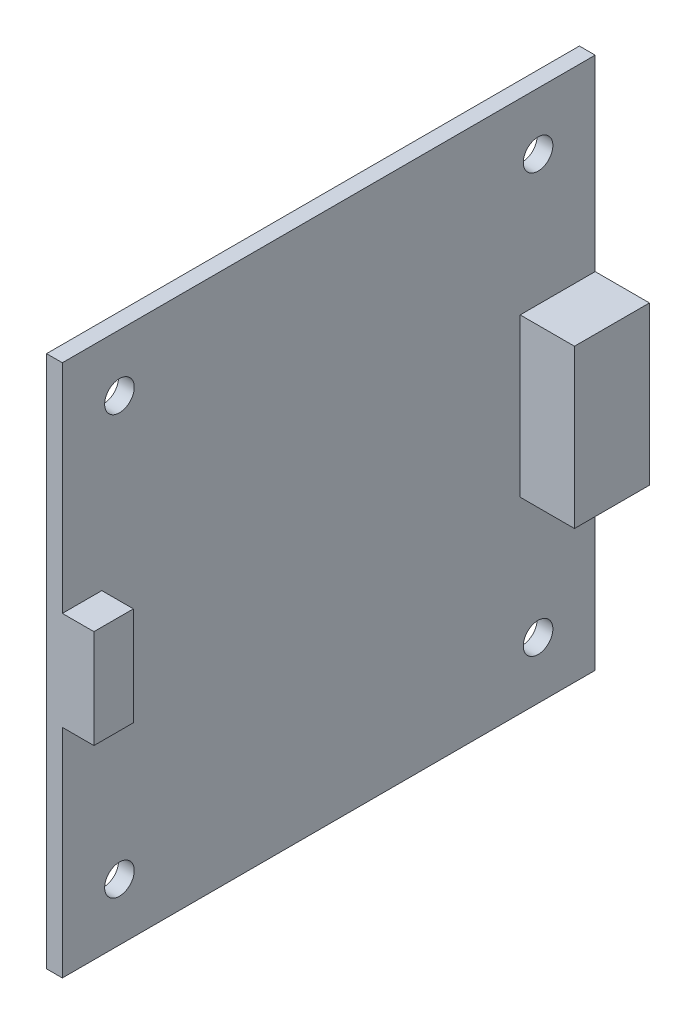
ISO-10303-21;
HEADER;
FILE_DESCRIPTION(('STEP AP214'),'2;1');
FILE_NAME('part.step','',(''),(''),'','','');
FILE_SCHEMA(('AUTOMOTIVE_DESIGN { 1 0 10303 214 1 1 1 1 }'));
ENDSEC;
DATA;
#1=APPLICATION_CONTEXT('core data for automotive mechanical design processes');
#2=APPLICATION_PROTOCOL_DEFINITION('international standard','automotive_design',2000,#1);
#3=PRODUCT_CONTEXT('',#1,'mechanical');
#4=PRODUCT('Part','Part','',(#3));
#5=PRODUCT_RELATED_PRODUCT_CATEGORY('part','',(#4));
#6=PRODUCT_DEFINITION_FORMATION('','',#4);
#7=PRODUCT_DEFINITION_CONTEXT('part definition',#1,'design');
#8=PRODUCT_DEFINITION('design','',#6,#7);
#9=PRODUCT_DEFINITION_SHAPE('','',#8);
#10=(LENGTH_UNIT() NAMED_UNIT(*) SI_UNIT(.MILLI.,.METRE.));
#11=(NAMED_UNIT(*) PLANE_ANGLE_UNIT() SI_UNIT($,.RADIAN.));
#12=(NAMED_UNIT(*) SI_UNIT($,.STERADIAN.) SOLID_ANGLE_UNIT());
#13=UNCERTAINTY_MEASURE_WITH_UNIT(LENGTH_MEASURE(1.E-05),#10,'distance_accuracy_value','');
#14=(GEOMETRIC_REPRESENTATION_CONTEXT(3) GLOBAL_UNCERTAINTY_ASSIGNED_CONTEXT((#13)) GLOBAL_UNIT_ASSIGNED_CONTEXT((#10,
#11,#12)) REPRESENTATION_CONTEXT('',''));
#15=CARTESIAN_POINT('',(0.,0.,0.));
#16=DIRECTION('',(0.,0.,1.));
#17=DIRECTION('',(1.,0.,0.));
#18=AXIS2_PLACEMENT_3D('',#15,#16,#17);
#19=CARTESIAN_POINT('',(0.,0.,0.));
#20=DIRECTION('',(1.,0.,0.));
#21=DIRECTION('',(0.,0.,-1.));
#22=AXIS2_PLACEMENT_3D('',#19,#20,#21);
#23=PLANE('',#22);
#24=DIRECTION('',(0.,0.,1.));
#25=VECTOR('',#24,1.);
#26=CARTESIAN_POINT('',(0.,27.,27.));
#27=LINE('',#26,#25);
#28=CARTESIAN_POINT('',(0.,27.,-27.));
#29=VERTEX_POINT('',#28);
#30=CARTESIAN_POINT('',(0.,27.,27.));
#31=VERTEX_POINT('',#30);
#32=EDGE_CURVE('E259',#29,#31,#27,.T.);
#33=ORIENTED_EDGE('',*,*,#32,.F.);
#34=DIRECTION('',(0.,1.,0.));
#35=VECTOR('',#34,1.);
#36=CARTESIAN_POINT('',(0.,-27.,-27.));
#37=LINE('',#36,#35);
#38=CARTESIAN_POINT('',(0.,-27.,-27.));
#39=VERTEX_POINT('',#38);
#40=EDGE_CURVE('E266',#39,#29,#37,.T.);
#41=ORIENTED_EDGE('',*,*,#40,.F.);
#42=DIRECTION('',(0.,0.,-1.));
#43=VECTOR('',#42,1.);
#44=CARTESIAN_POINT('',(0.,-27.,27.));
#45=LINE('',#44,#43);
#46=CARTESIAN_POINT('',(0.,-27.,27.));
#47=VERTEX_POINT('',#46);
#48=EDGE_CURVE('E278',#47,#39,#45,.T.);
#49=ORIENTED_EDGE('',*,*,#48,.F.);
#50=DIRECTION('',(0.,-1.,0.));
#51=VECTOR('',#50,1.);
#52=CARTESIAN_POINT('',(0.,-27.,27.));
#53=LINE('',#52,#51);
#54=EDGE_CURVE('E279',#31,#47,#53,.T.);
#55=ORIENTED_EDGE('',*,*,#54,.F.);
#56=EDGE_LOOP('',(#33,#41,#49,#55));
#57=FACE_BOUND('',#56,.T.);
#58=CARTESIAN_POINT('',(0.,-21.2132034355964,21.2132034355964));
#59=DIRECTION('',(1.,0.,0.));
#60=DIRECTION('',(0.,0.,-1.));
#61=AXIS2_PLACEMENT_3D('',#58,#59,#60);
#62=CIRCLE('',#61,1.5);
#63=CARTESIAN_POINT('',(0.,-21.2132034355964,19.7132034355964));
#64=VERTEX_POINT('',#63);
#65=EDGE_CURVE('E258',#64,#64,#62,.T.);
#66=ORIENTED_EDGE('',*,*,#65,.T.);
#67=EDGE_LOOP('',(#66));
#68=FACE_BOUND('',#67,.T.);
#69=CARTESIAN_POINT('',(0.,21.2132034355964,-21.2132034355964));
#70=DIRECTION('',(1.,0.,0.));
#71=DIRECTION('',(0.,0.,-1.));
#72=AXIS2_PLACEMENT_3D('',#69,#70,#71);
#73=CIRCLE('',#72,1.5);
#74=CARTESIAN_POINT('',(0.,21.2132034355964,-22.7132034355964));
#75=VERTEX_POINT('',#74);
#76=EDGE_CURVE('E240',#75,#75,#73,.T.);
#77=ORIENTED_EDGE('',*,*,#76,.T.);
#78=EDGE_LOOP('',(#77));
#79=FACE_BOUND('',#78,.T.);
#80=CARTESIAN_POINT('',(0.,-21.2132034355964,-21.2132034355964));
#81=DIRECTION('',(1.,0.,0.));
#82=DIRECTION('',(0.,0.,-1.));
#83=AXIS2_PLACEMENT_3D('',#80,#81,#82);
#84=CIRCLE('',#83,1.5);
#85=CARTESIAN_POINT('',(0.,-21.2132034355964,-22.7132034355964));
#86=VERTEX_POINT('',#85);
#87=EDGE_CURVE('E243',#86,#86,#84,.T.);
#88=ORIENTED_EDGE('',*,*,#87,.T.);
#89=EDGE_LOOP('',(#88));
#90=FACE_BOUND('',#89,.T.);
#91=CARTESIAN_POINT('',(0.,21.2132034355964,21.2132034355964));
#92=DIRECTION('',(1.,0.,0.));
#93=DIRECTION('',(0.,0.,-1.));
#94=AXIS2_PLACEMENT_3D('',#91,#92,#93);
#95=CIRCLE('',#94,1.5);
#96=CARTESIAN_POINT('',(0.,21.2132034355964,19.7132034355964));
#97=VERTEX_POINT('',#96);
#98=EDGE_CURVE('E248',#97,#97,#95,.T.);
#99=ORIENTED_EDGE('',*,*,#98,.T.);
#100=EDGE_LOOP('',(#99));
#101=FACE_BOUND('',#100,.T.);
#102=DIRECTION('',(0.,0.,1.));
#103=VECTOR('',#102,1.);
#104=CARTESIAN_POINT('',(0.,-2.1,1.6));
#105=LINE('',#104,#103);
#106=CARTESIAN_POINT('',(0.,-2.1,-1.6));
#107=VERTEX_POINT('',#106);
#108=CARTESIAN_POINT('',(0.,-2.1,1.6));
#109=VERTEX_POINT('',#108);
#110=EDGE_CURVE('E204',#107,#109,#105,.T.);
#111=ORIENTED_EDGE('',*,*,#110,.F.);
#112=DIRECTION('',(0.,-1.,0.));
#113=VECTOR('',#112,1.);
#114=CARTESIAN_POINT('',(0.,2.1,-1.6));
#115=LINE('',#114,#113);
#116=CARTESIAN_POINT('',(0.,2.1,-1.6));
#117=VERTEX_POINT('',#116);
#118=EDGE_CURVE('E207',#117,#107,#115,.T.);
#119=ORIENTED_EDGE('',*,*,#118,.F.);
#120=DIRECTION('',(0.,0.,-1.));
#121=VECTOR('',#120,1.);
#122=CARTESIAN_POINT('',(0.,2.1,1.6));
#123=LINE('',#122,#121);
#124=CARTESIAN_POINT('',(0.,2.1,1.6));
#125=VERTEX_POINT('',#124);
#126=EDGE_CURVE('E222',#125,#117,#123,.T.);
#127=ORIENTED_EDGE('',*,*,#126,.F.);
#128=DIRECTION('',(0.,1.,0.));
#129=VECTOR('',#128,1.);
#130=CARTESIAN_POINT('',(0.,2.1,1.6));
#131=LINE('',#130,#129);
#132=EDGE_CURVE('E217',#109,#125,#131,.T.);
#133=ORIENTED_EDGE('',*,*,#132,.F.);
#134=EDGE_LOOP('',(#111,#119,#127,#133));
#135=FACE_BOUND('',#134,.T.);
#136=ADVANCED_FACE('F39',(#57,#68,#79,#90,#101,#135),#23,.F.);
#137=CARTESIAN_POINT('',(1.6,27.,27.));
#138=DIRECTION('',(0.,-1.,0.));
#139=DIRECTION('',(0.,0.,-1.));
#140=AXIS2_PLACEMENT_3D('',#137,#138,#139);
#141=PLANE('',#140);
#142=ORIENTED_EDGE('',*,*,#32,.T.);
#143=DIRECTION('',(-1.,0.,0.));
#144=VECTOR('',#143,1.);
#145=CARTESIAN_POINT('',(1.6,27.,27.));
#146=LINE('',#145,#144);
#147=CARTESIAN_POINT('',(1.6,27.,27.));
#148=VERTEX_POINT('',#147);
#149=EDGE_CURVE('E11',#148,#31,#146,.T.);
#150=ORIENTED_EDGE('',*,*,#149,.F.);
#151=DIRECTION('',(0.,0.,1.));
#152=VECTOR('',#151,1.);
#153=CARTESIAN_POINT('',(1.6,27.,27.));
#154=LINE('',#153,#152);
#155=CARTESIAN_POINT('',(1.6,27.,-27.));
#156=VERTEX_POINT('',#155);
#157=EDGE_CURVE('E265',#156,#148,#154,.T.);
#158=ORIENTED_EDGE('',*,*,#157,.F.);
#159=DIRECTION('',(-1.,0.,0.));
#160=VECTOR('',#159,1.);
#161=CARTESIAN_POINT('',(1.6,27.,-27.));
#162=LINE('',#161,#160);
#163=EDGE_CURVE('E274',#156,#29,#162,.T.);
#164=ORIENTED_EDGE('',*,*,#163,.T.);
#165=EDGE_LOOP('',(#142,#150,#158,#164));
#166=FACE_BOUND('',#165,.T.);
#167=ADVANCED_FACE('F41',(#166),#141,.F.);
#168=CARTESIAN_POINT('',(1.6,-27.,27.));
#169=DIRECTION('',(0.,0.,-1.));
#170=DIRECTION('',(-1.,0.,0.));
#171=AXIS2_PLACEMENT_3D('',#168,#169,#170);
#172=PLANE('',#171);
#173=ORIENTED_EDGE('',*,*,#54,.T.);
#174=DIRECTION('',(-1.,0.,0.));
#175=VECTOR('',#174,1.);
#176=CARTESIAN_POINT('',(1.6,-27.,27.));
#177=LINE('',#176,#175);
#178=CARTESIAN_POINT('',(1.6,-27.,27.));
#179=VERTEX_POINT('',#178);
#180=EDGE_CURVE('E50',#179,#47,#177,.T.);
#181=ORIENTED_EDGE('',*,*,#180,.F.);
#182=DIRECTION('',(0.,-1.,0.));
#183=VECTOR('',#182,1.);
#184=CARTESIAN_POINT('',(1.6,-27.,27.));
#185=LINE('',#184,#183);
#186=CARTESIAN_POINT('',(1.6,-5.,27.));
#187=VERTEX_POINT('',#186);
#188=EDGE_CURVE('E264',#187,#179,#185,.T.);
#189=ORIENTED_EDGE('',*,*,#188,.F.);
#190=DIRECTION('',(-1.,0.,0.));
#191=VECTOR('',#190,1.);
#192=CARTESIAN_POINT('',(4.8,-5.,27.));
#193=LINE('',#192,#191);
#194=CARTESIAN_POINT('',(4.8,-5.,27.));
#195=VERTEX_POINT('',#194);
#196=EDGE_CURVE('E351',#195,#187,#193,.T.);
#197=ORIENTED_EDGE('',*,*,#196,.F.);
#198=DIRECTION('',(0.,-1.,0.));
#199=VECTOR('',#198,1.);
#200=CARTESIAN_POINT('',(4.8,-5.,27.));
#201=LINE('',#200,#199);
#202=CARTESIAN_POINT('',(4.8,5.,27.));
#203=VERTEX_POINT('',#202);
#204=EDGE_CURVE('E170',#203,#195,#201,.T.);
#205=ORIENTED_EDGE('',*,*,#204,.F.);
#206=DIRECTION('',(-1.,0.,0.));
#207=VECTOR('',#206,1.);
#208=CARTESIAN_POINT('',(4.8,5.,27.));
#209=LINE('',#208,#207);
#210=CARTESIAN_POINT('',(1.6,5.,27.));
#211=VERTEX_POINT('',#210);
#212=EDGE_CURVE('E171',#203,#211,#209,.T.);
#213=ORIENTED_EDGE('',*,*,#212,.T.);
#214=EDGE_CURVE('E270',#148,#211,#185,.T.);
#215=ORIENTED_EDGE('',*,*,#214,.F.);
#216=ORIENTED_EDGE('',*,*,#149,.T.);
#217=EDGE_LOOP('',(#173,#181,#189,#197,#205,#213,#215,#216));
#218=FACE_BOUND('',#217,.T.);
#219=ADVANCED_FACE('F341',(#218),#172,.F.);
#220=CARTESIAN_POINT('',(1.6,-27.,27.));
#221=DIRECTION('',(0.,1.,0.));
#222=DIRECTION('',(0.,0.,1.));
#223=AXIS2_PLACEMENT_3D('',#220,#221,#222);
#224=PLANE('',#223);
#225=ORIENTED_EDGE('',*,*,#48,.T.);
#226=DIRECTION('',(-1.,0.,0.));
#227=VECTOR('',#226,1.);
#228=CARTESIAN_POINT('',(1.6,-27.,-27.));
#229=LINE('',#228,#227);
#230=CARTESIAN_POINT('',(1.6,-27.,-27.));
#231=VERTEX_POINT('',#230);
#232=EDGE_CURVE('E281',#231,#39,#229,.T.);
#233=ORIENTED_EDGE('',*,*,#232,.F.);
#234=DIRECTION('',(0.,0.,-1.));
#235=VECTOR('',#234,1.);
#236=CARTESIAN_POINT('',(1.6,-27.,27.));
#237=LINE('',#236,#235);
#238=EDGE_CURVE('E269',#179,#231,#237,.T.);
#239=ORIENTED_EDGE('',*,*,#238,.F.);
#240=ORIENTED_EDGE('',*,*,#180,.T.);
#241=EDGE_LOOP('',(#225,#233,#239,#240));
#242=FACE_BOUND('',#241,.T.);
#243=ADVANCED_FACE('F295',(#242),#224,.F.);
#244=CARTESIAN_POINT('',(1.6,-27.,-27.));
#245=DIRECTION('',(0.,0.,1.));
#246=DIRECTION('',(1.,0.,0.));
#247=AXIS2_PLACEMENT_3D('',#244,#245,#246);
#248=PLANE('',#247);
#249=ORIENTED_EDGE('',*,*,#40,.T.);
#250=ORIENTED_EDGE('',*,*,#163,.F.);
#251=DIRECTION('',(0.,1.,0.));
#252=VECTOR('',#251,1.);
#253=CARTESIAN_POINT('',(1.6,-27.,-27.));
#254=LINE('',#253,#252);
#255=CARTESIAN_POINT('',(1.6,8.,-27.));
#256=VERTEX_POINT('',#255);
#257=EDGE_CURVE('E275',#256,#156,#254,.T.);
#258=ORIENTED_EDGE('',*,*,#257,.F.);
#259=DIRECTION('',(-1.,0.,0.));
#260=VECTOR('',#259,1.);
#261=CARTESIAN_POINT('',(7.1,8.,-27.));
#262=LINE('',#261,#260);
#263=CARTESIAN_POINT('',(7.1,8.,-27.));
#264=VERTEX_POINT('',#263);
#265=EDGE_CURVE('E196',#264,#256,#262,.T.);
#266=ORIENTED_EDGE('',*,*,#265,.F.);
#267=DIRECTION('',(0.,1.,0.));
#268=VECTOR('',#267,1.);
#269=CARTESIAN_POINT('',(7.1,-8.,-27.));
#270=LINE('',#269,#268);
#271=CARTESIAN_POINT('',(7.1,-8.,-27.));
#272=VERTEX_POINT('',#271);
#273=EDGE_CURVE('E185',#272,#264,#270,.T.);
#274=ORIENTED_EDGE('',*,*,#273,.F.);
#275=DIRECTION('',(-1.,0.,0.));
#276=VECTOR('',#275,1.);
#277=CARTESIAN_POINT('',(7.1,-8.,-27.));
#278=LINE('',#277,#276);
#279=CARTESIAN_POINT('',(1.6,-8.,-27.));
#280=VERTEX_POINT('',#279);
#281=EDGE_CURVE('E203',#272,#280,#278,.T.);
#282=ORIENTED_EDGE('',*,*,#281,.T.);
#283=EDGE_CURVE('E272',#231,#280,#254,.T.);
#284=ORIENTED_EDGE('',*,*,#283,.F.);
#285=ORIENTED_EDGE('',*,*,#232,.T.);
#286=EDGE_LOOP('',(#249,#250,#258,#266,#274,#282,#284,#285));
#287=FACE_BOUND('',#286,.T.);
#288=ADVANCED_FACE('F305',(#287),#248,.F.);
#289=CARTESIAN_POINT('',(1.6,0.,0.));
#290=DIRECTION('',(1.,0.,0.));
#291=DIRECTION('',(0.,0.,-1.));
#292=AXIS2_PLACEMENT_3D('',#289,#290,#291);
#293=PLANE('',#292);
#294=DIRECTION('',(0.,0.,-1.));
#295=VECTOR('',#294,1.);
#296=CARTESIAN_POINT('',(1.6,-5.,27.));
#297=LINE('',#296,#295);
#298=CARTESIAN_POINT('',(1.6,-5.,23.));
#299=VERTEX_POINT('',#298);
#300=EDGE_CURVE('E53',#187,#299,#297,.T.);
#301=ORIENTED_EDGE('',*,*,#300,.F.);
#302=ORIENTED_EDGE('',*,*,#188,.T.);
#303=ORIENTED_EDGE('',*,*,#238,.T.);
#304=ORIENTED_EDGE('',*,*,#283,.T.);
#305=DIRECTION('',(0.,0.,-1.));
#306=VECTOR('',#305,1.);
#307=CARTESIAN_POINT('',(1.6,-8.,-27.));
#308=LINE('',#307,#306);
#309=CARTESIAN_POINT('',(1.6,-8.,-19.4));
#310=VERTEX_POINT('',#309);
#311=EDGE_CURVE('E64',#310,#280,#308,.T.);
#312=ORIENTED_EDGE('',*,*,#311,.F.);
#313=DIRECTION('',(0.,-1.,0.));
#314=VECTOR('',#313,1.);
#315=CARTESIAN_POINT('',(1.6,-8.,-19.4));
#316=LINE('',#315,#314);
#317=CARTESIAN_POINT('',(1.6,8.,-19.4));
#318=VERTEX_POINT('',#317);
#319=EDGE_CURVE('E181',#318,#310,#316,.T.);
#320=ORIENTED_EDGE('',*,*,#319,.F.);
#321=DIRECTION('',(0.,0.,1.));
#322=VECTOR('',#321,1.);
#323=CARTESIAN_POINT('',(1.6,8.,-27.));
#324=LINE('',#323,#322);
#325=EDGE_CURVE('E172',#256,#318,#324,.T.);
#326=ORIENTED_EDGE('',*,*,#325,.F.);
#327=ORIENTED_EDGE('',*,*,#257,.T.);
#328=ORIENTED_EDGE('',*,*,#157,.T.);
#329=ORIENTED_EDGE('',*,*,#214,.T.);
#330=DIRECTION('',(0.,0.,1.));
#331=VECTOR('',#330,1.);
#332=CARTESIAN_POINT('',(1.6,5.,27.));
#333=LINE('',#332,#331);
#334=CARTESIAN_POINT('',(1.6,5.,23.));
#335=VERTEX_POINT('',#334);
#336=EDGE_CURVE('E166',#335,#211,#333,.T.);
#337=ORIENTED_EDGE('',*,*,#336,.F.);
#338=DIRECTION('',(0.,1.,0.));
#339=VECTOR('',#338,1.);
#340=CARTESIAN_POINT('',(1.6,-5.,23.));
#341=LINE('',#340,#339);
#342=EDGE_CURVE('E357',#299,#335,#341,.T.);
#343=ORIENTED_EDGE('',*,*,#342,.F.);
#344=EDGE_LOOP('',(#301,#302,#303,#304,#312,#320,#326,#327,#328,#329,#337,#343));
#345=FACE_BOUND('',#344,.T.);
#346=CARTESIAN_POINT('',(1.6,21.2132034355964,21.2132034355964));
#347=DIRECTION('',(1.,0.,0.));
#348=DIRECTION('',(0.,0.,-1.));
#349=AXIS2_PLACEMENT_3D('',#346,#347,#348);
#350=CIRCLE('',#349,1.5);
#351=CARTESIAN_POINT('',(1.6,21.2132034355964,19.7132034355964));
#352=VERTEX_POINT('',#351);
#353=EDGE_CURVE('E245',#352,#352,#350,.T.);
#354=ORIENTED_EDGE('',*,*,#353,.F.);
#355=EDGE_LOOP('',(#354));
#356=FACE_BOUND('',#355,.T.);
#357=CARTESIAN_POINT('',(1.6,-21.2132034355964,-21.2132034355964));
#358=DIRECTION('',(1.,0.,0.));
#359=DIRECTION('',(0.,0.,-1.));
#360=AXIS2_PLACEMENT_3D('',#357,#358,#359);
#361=CIRCLE('',#360,1.5);
#362=CARTESIAN_POINT('',(1.6,-21.2132034355964,-22.7132034355964));
#363=VERTEX_POINT('',#362);
#364=EDGE_CURVE('E253',#363,#363,#361,.T.);
#365=ORIENTED_EDGE('',*,*,#364,.F.);
#366=EDGE_LOOP('',(#365));
#367=FACE_BOUND('',#366,.T.);
#368=CARTESIAN_POINT('',(1.6,21.2132034355964,-21.2132034355964));
#369=DIRECTION('',(1.,0.,0.));
#370=DIRECTION('',(0.,0.,-1.));
#371=AXIS2_PLACEMENT_3D('',#368,#369,#370);
#372=CIRCLE('',#371,1.5);
#373=CARTESIAN_POINT('',(1.6,21.2132034355964,-22.7132034355964));
#374=VERTEX_POINT('',#373);
#375=EDGE_CURVE('E236',#374,#374,#372,.T.);
#376=ORIENTED_EDGE('',*,*,#375,.F.);
#377=EDGE_LOOP('',(#376));
#378=FACE_BOUND('',#377,.T.);
#379=CARTESIAN_POINT('',(1.6,-21.2132034355964,21.2132034355964));
#380=DIRECTION('',(1.,0.,0.));
#381=DIRECTION('',(0.,0.,-1.));
#382=AXIS2_PLACEMENT_3D('',#379,#380,#381);
#383=CIRCLE('',#382,1.5);
#384=CARTESIAN_POINT('',(1.6,-21.2132034355964,19.7132034355964));
#385=VERTEX_POINT('',#384);
#386=EDGE_CURVE('E250',#385,#385,#383,.T.);
#387=ORIENTED_EDGE('',*,*,#386,.F.);
#388=EDGE_LOOP('',(#387));
#389=FACE_BOUND('',#388,.T.);
#390=ADVANCED_FACE('F306',(#345,#356,#367,#378,#389),#293,.T.);
#391=CARTESIAN_POINT('',(0.,-21.2132034355964,21.2132034355964));
#392=DIRECTION('',(1.,0.,0.));
#393=DIRECTION('',(0.,0.,-1.));
#394=AXIS2_PLACEMENT_3D('',#391,#392,#393);
#395=CYLINDRICAL_SURFACE('',#394,1.5);
#396=ORIENTED_EDGE('',*,*,#65,.F.);
#397=EDGE_LOOP('',(#396));
#398=FACE_BOUND('',#397,.T.);
#399=ORIENTED_EDGE('',*,*,#386,.T.);
#400=EDGE_LOOP('',(#399));
#401=FACE_BOUND('',#400,.T.);
#402=ADVANCED_FACE('F491',(#398,#401),#395,.F.);
#403=CARTESIAN_POINT('',(0.,21.2132034355964,-21.2132034355964));
#404=DIRECTION('',(1.,0.,0.));
#405=DIRECTION('',(0.,0.,-1.));
#406=AXIS2_PLACEMENT_3D('',#403,#404,#405);
#407=CYLINDRICAL_SURFACE('',#406,1.5);
#408=ORIENTED_EDGE('',*,*,#76,.F.);
#409=EDGE_LOOP('',(#408));
#410=FACE_BOUND('',#409,.T.);
#411=ORIENTED_EDGE('',*,*,#375,.T.);
#412=EDGE_LOOP('',(#411));
#413=FACE_BOUND('',#412,.T.);
#414=ADVANCED_FACE('F485',(#410,#413),#407,.F.);
#415=CARTESIAN_POINT('',(0.,-21.2132034355964,-21.2132034355964));
#416=DIRECTION('',(1.,0.,0.));
#417=DIRECTION('',(0.,0.,-1.));
#418=AXIS2_PLACEMENT_3D('',#415,#416,#417);
#419=CYLINDRICAL_SURFACE('',#418,1.5);
#420=ORIENTED_EDGE('',*,*,#87,.F.);
#421=EDGE_LOOP('',(#420));
#422=FACE_BOUND('',#421,.T.);
#423=ORIENTED_EDGE('',*,*,#364,.T.);
#424=EDGE_LOOP('',(#423));
#425=FACE_BOUND('',#424,.T.);
#426=ADVANCED_FACE('F471',(#422,#425),#419,.F.);
#427=CARTESIAN_POINT('',(0.,21.2132034355964,21.2132034355964));
#428=DIRECTION('',(1.,0.,0.));
#429=DIRECTION('',(0.,0.,-1.));
#430=AXIS2_PLACEMENT_3D('',#427,#428,#429);
#431=CYLINDRICAL_SURFACE('',#430,1.5);
#432=ORIENTED_EDGE('',*,*,#98,.F.);
#433=EDGE_LOOP('',(#432));
#434=FACE_BOUND('',#433,.T.);
#435=ORIENTED_EDGE('',*,*,#353,.T.);
#436=EDGE_LOOP('',(#435));
#437=FACE_BOUND('',#436,.T.);
#438=ADVANCED_FACE('F458',(#434,#437),#431,.F.);
#439=CARTESIAN_POINT('',(-1.2,-2.1,1.6));
#440=DIRECTION('',(0.,1.,0.));
#441=DIRECTION('',(0.,0.,1.));
#442=AXIS2_PLACEMENT_3D('',#439,#440,#441);
#443=PLANE('',#442);
#444=ORIENTED_EDGE('',*,*,#110,.T.);
#445=DIRECTION('',(1.,0.,0.));
#446=VECTOR('',#445,1.);
#447=CARTESIAN_POINT('',(-1.2,-2.1,1.6));
#448=LINE('',#447,#446);
#449=CARTESIAN_POINT('',(-1.2,-2.1,1.6));
#450=VERTEX_POINT('',#449);
#451=EDGE_CURVE('E232',#450,#109,#448,.T.);
#452=ORIENTED_EDGE('',*,*,#451,.F.);
#453=DIRECTION('',(0.,0.,1.));
#454=VECTOR('',#453,1.);
#455=CARTESIAN_POINT('',(-1.2,-2.1,1.6));
#456=LINE('',#455,#454);
#457=CARTESIAN_POINT('',(-1.2,-2.1,-1.6));
#458=VERTEX_POINT('',#457);
#459=EDGE_CURVE('E202',#458,#450,#456,.T.);
#460=ORIENTED_EDGE('',*,*,#459,.F.);
#461=DIRECTION('',(1.,0.,0.));
#462=VECTOR('',#461,1.);
#463=CARTESIAN_POINT('',(-1.2,-2.1,-1.6));
#464=LINE('',#463,#462);
#465=EDGE_CURVE('E214',#458,#107,#464,.T.);
#466=ORIENTED_EDGE('',*,*,#465,.T.);
#467=EDGE_LOOP('',(#444,#452,#460,#466));
#468=FACE_BOUND('',#467,.T.);
#469=ADVANCED_FACE('F453',(#468),#443,.F.);
#470=CARTESIAN_POINT('',(-1.2,2.1,1.6));
#471=DIRECTION('',(0.,0.,-1.));
#472=DIRECTION('',(-1.,0.,0.));
#473=AXIS2_PLACEMENT_3D('',#470,#471,#472);
#474=PLANE('',#473);
#475=ORIENTED_EDGE('',*,*,#132,.T.);
#476=DIRECTION('',(1.,0.,0.));
#477=VECTOR('',#476,1.);
#478=CARTESIAN_POINT('',(-1.2,2.1,1.6));
#479=LINE('',#478,#477);
#480=CARTESIAN_POINT('',(-1.2,2.1,1.6));
#481=VERTEX_POINT('',#480);
#482=EDGE_CURVE('E231',#481,#125,#479,.T.);
#483=ORIENTED_EDGE('',*,*,#482,.F.);
#484=DIRECTION('',(0.,1.,0.));
#485=VECTOR('',#484,1.);
#486=CARTESIAN_POINT('',(-1.2,2.1,1.6));
#487=LINE('',#486,#485);
#488=EDGE_CURVE('E208',#450,#481,#487,.T.);
#489=ORIENTED_EDGE('',*,*,#488,.F.);
#490=ORIENTED_EDGE('',*,*,#451,.T.);
#491=EDGE_LOOP('',(#475,#483,#489,#490));
#492=FACE_BOUND('',#491,.T.);
#493=ADVANCED_FACE('F441',(#492),#474,.F.);
#494=CARTESIAN_POINT('',(-1.2,2.1,1.6));
#495=DIRECTION('',(0.,-1.,0.));
#496=DIRECTION('',(0.,0.,-1.));
#497=AXIS2_PLACEMENT_3D('',#494,#495,#496);
#498=PLANE('',#497);
#499=ORIENTED_EDGE('',*,*,#126,.T.);
#500=DIRECTION('',(1.,0.,0.));
#501=VECTOR('',#500,1.);
#502=CARTESIAN_POINT('',(-1.2,2.1,-1.6));
#503=LINE('',#502,#501);
#504=CARTESIAN_POINT('',(-1.2,2.1,-1.6));
#505=VERTEX_POINT('',#504);
#506=EDGE_CURVE('E227',#505,#117,#503,.T.);
#507=ORIENTED_EDGE('',*,*,#506,.F.);
#508=DIRECTION('',(0.,0.,-1.));
#509=VECTOR('',#508,1.);
#510=CARTESIAN_POINT('',(-1.2,2.1,1.6));
#511=LINE('',#510,#509);
#512=EDGE_CURVE('E211',#481,#505,#511,.T.);
#513=ORIENTED_EDGE('',*,*,#512,.F.);
#514=ORIENTED_EDGE('',*,*,#482,.T.);
#515=EDGE_LOOP('',(#499,#507,#513,#514));
#516=FACE_BOUND('',#515,.T.);
#517=ADVANCED_FACE('F434',(#516),#498,.F.);
#518=CARTESIAN_POINT('',(-1.2,2.1,-1.6));
#519=DIRECTION('',(0.,0.,1.));
#520=DIRECTION('',(1.,0.,0.));
#521=AXIS2_PLACEMENT_3D('',#518,#519,#520);
#522=PLANE('',#521);
#523=ORIENTED_EDGE('',*,*,#118,.T.);
#524=ORIENTED_EDGE('',*,*,#465,.F.);
#525=DIRECTION('',(0.,-1.,0.));
#526=VECTOR('',#525,1.);
#527=CARTESIAN_POINT('',(-1.2,2.1,-1.6));
#528=LINE('',#527,#526);
#529=EDGE_CURVE('E213',#505,#458,#528,.T.);
#530=ORIENTED_EDGE('',*,*,#529,.F.);
#531=ORIENTED_EDGE('',*,*,#506,.T.);
#532=EDGE_LOOP('',(#523,#524,#530,#531));
#533=FACE_BOUND('',#532,.T.);
#534=ADVANCED_FACE('F426',(#533),#522,.F.);
#535=CARTESIAN_POINT('',(-1.2,0.,0.));
#536=DIRECTION('',(-1.,0.,0.));
#537=DIRECTION('',(0.,0.,1.));
#538=AXIS2_PLACEMENT_3D('',#535,#536,#537);
#539=PLANE('',#538);
#540=ORIENTED_EDGE('',*,*,#459,.T.);
#541=ORIENTED_EDGE('',*,*,#488,.T.);
#542=ORIENTED_EDGE('',*,*,#512,.T.);
#543=ORIENTED_EDGE('',*,*,#529,.T.);
#544=EDGE_LOOP('',(#540,#541,#542,#543));
#545=FACE_BOUND('',#544,.T.);
#546=ADVANCED_FACE('F417',(#545),#539,.T.);
#547=CARTESIAN_POINT('',(7.1,-8.,-27.));
#548=DIRECTION('',(0.,1.,0.));
#549=DIRECTION('',(0.,0.,1.));
#550=AXIS2_PLACEMENT_3D('',#547,#548,#549);
#551=PLANE('',#550);
#552=ORIENTED_EDGE('',*,*,#311,.T.);
#553=ORIENTED_EDGE('',*,*,#281,.F.);
#554=DIRECTION('',(0.,0.,-1.));
#555=VECTOR('',#554,1.);
#556=CARTESIAN_POINT('',(7.1,-8.,-27.));
#557=LINE('',#556,#555);
#558=CARTESIAN_POINT('',(7.1,-8.,-19.4));
#559=VERTEX_POINT('',#558);
#560=EDGE_CURVE('E177',#559,#272,#557,.T.);
#561=ORIENTED_EDGE('',*,*,#560,.F.);
#562=DIRECTION('',(-1.,0.,0.));
#563=VECTOR('',#562,1.);
#564=CARTESIAN_POINT('',(7.1,-8.,-19.4));
#565=LINE('',#564,#563);
#566=EDGE_CURVE('E187',#559,#310,#565,.T.);
#567=ORIENTED_EDGE('',*,*,#566,.T.);
#568=EDGE_LOOP('',(#552,#553,#561,#567));
#569=FACE_BOUND('',#568,.T.);
#570=ADVANCED_FACE('F323',(#569),#551,.F.);
#571=CARTESIAN_POINT('',(7.1,8.,-27.));
#572=DIRECTION('',(0.,-1.,0.));
#573=DIRECTION('',(0.,0.,-1.));
#574=AXIS2_PLACEMENT_3D('',#571,#572,#573);
#575=PLANE('',#574);
#576=ORIENTED_EDGE('',*,*,#325,.T.);
#577=DIRECTION('',(-1.,0.,0.));
#578=VECTOR('',#577,1.);
#579=CARTESIAN_POINT('',(7.1,8.,-19.4));
#580=LINE('',#579,#578);
#581=CARTESIAN_POINT('',(7.1,8.,-19.4));
#582=VERTEX_POINT('',#581);
#583=EDGE_CURVE('E194',#582,#318,#580,.T.);
#584=ORIENTED_EDGE('',*,*,#583,.F.);
#585=DIRECTION('',(0.,0.,1.));
#586=VECTOR('',#585,1.);
#587=CARTESIAN_POINT('',(7.1,8.,-27.));
#588=LINE('',#587,#586);
#589=EDGE_CURVE('E183',#264,#582,#588,.T.);
#590=ORIENTED_EDGE('',*,*,#589,.F.);
#591=ORIENTED_EDGE('',*,*,#265,.T.);
#592=EDGE_LOOP('',(#576,#584,#590,#591));
#593=FACE_BOUND('',#592,.T.);
#594=ADVANCED_FACE('F314',(#593),#575,.F.);
#595=CARTESIAN_POINT('',(7.1,-8.,-19.4));
#596=DIRECTION('',(0.,0.,-1.));
#597=DIRECTION('',(-1.,0.,0.));
#598=AXIS2_PLACEMENT_3D('',#595,#596,#597);
#599=PLANE('',#598);
#600=ORIENTED_EDGE('',*,*,#319,.T.);
#601=ORIENTED_EDGE('',*,*,#566,.F.);
#602=DIRECTION('',(0.,-1.,0.));
#603=VECTOR('',#602,1.);
#604=CARTESIAN_POINT('',(7.1,-8.,-19.4));
#605=LINE('',#604,#603);
#606=EDGE_CURVE('E189',#582,#559,#605,.T.);
#607=ORIENTED_EDGE('',*,*,#606,.F.);
#608=ORIENTED_EDGE('',*,*,#583,.T.);
#609=EDGE_LOOP('',(#600,#601,#607,#608));
#610=FACE_BOUND('',#609,.T.);
#611=ADVANCED_FACE('F324',(#610),#599,.F.);
#612=CARTESIAN_POINT('',(7.1,0.,0.));
#613=DIRECTION('',(-1.,0.,0.));
#614=DIRECTION('',(0.,0.,1.));
#615=AXIS2_PLACEMENT_3D('',#612,#613,#614);
#616=PLANE('',#615);
#617=ORIENTED_EDGE('',*,*,#560,.T.);
#618=ORIENTED_EDGE('',*,*,#273,.T.);
#619=ORIENTED_EDGE('',*,*,#589,.T.);
#620=ORIENTED_EDGE('',*,*,#606,.T.);
#621=EDGE_LOOP('',(#617,#618,#619,#620));
#622=FACE_BOUND('',#621,.T.);
#623=ADVANCED_FACE('F318',(#622),#616,.F.);
#624=CARTESIAN_POINT('',(4.8,-5.,27.));
#625=DIRECTION('',(0.,1.,0.));
#626=DIRECTION('',(0.,0.,1.));
#627=AXIS2_PLACEMENT_3D('',#624,#625,#626);
#628=PLANE('',#627);
#629=ORIENTED_EDGE('',*,*,#300,.T.);
#630=DIRECTION('',(-1.,0.,0.));
#631=VECTOR('',#630,1.);
#632=CARTESIAN_POINT('',(4.8,-5.,23.));
#633=LINE('',#632,#631);
#634=CARTESIAN_POINT('',(4.8,-5.,23.));
#635=VERTEX_POINT('',#634);
#636=EDGE_CURVE('E154',#635,#299,#633,.T.);
#637=ORIENTED_EDGE('',*,*,#636,.F.);
#638=DIRECTION('',(0.,0.,-1.));
#639=VECTOR('',#638,1.);
#640=CARTESIAN_POINT('',(4.8,-5.,27.));
#641=LINE('',#640,#639);
#642=EDGE_CURVE('E165',#195,#635,#641,.T.);
#643=ORIENTED_EDGE('',*,*,#642,.F.);
#644=ORIENTED_EDGE('',*,*,#196,.T.);
#645=EDGE_LOOP('',(#629,#637,#643,#644));
#646=FACE_BOUND('',#645,.T.);
#647=ADVANCED_FACE('F173',(#646),#628,.F.);
#648=CARTESIAN_POINT('',(4.8,-5.,23.));
#649=DIRECTION('',(0.,0.,1.));
#650=DIRECTION('',(1.,0.,0.));
#651=AXIS2_PLACEMENT_3D('',#648,#649,#650);
#652=PLANE('',#651);
#653=ORIENTED_EDGE('',*,*,#342,.T.);
#654=DIRECTION('',(-1.,0.,0.));
#655=VECTOR('',#654,1.);
#656=CARTESIAN_POINT('',(4.8,5.,23.));
#657=LINE('',#656,#655);
#658=CARTESIAN_POINT('',(4.8,5.,23.));
#659=VERTEX_POINT('',#658);
#660=EDGE_CURVE('E158',#659,#335,#657,.T.);
#661=ORIENTED_EDGE('',*,*,#660,.F.);
#662=DIRECTION('',(0.,1.,0.));
#663=VECTOR('',#662,1.);
#664=CARTESIAN_POINT('',(4.8,-5.,23.));
#665=LINE('',#664,#663);
#666=EDGE_CURVE('E155',#635,#659,#665,.T.);
#667=ORIENTED_EDGE('',*,*,#666,.F.);
#668=ORIENTED_EDGE('',*,*,#636,.T.);
#669=EDGE_LOOP('',(#653,#661,#667,#668));
#670=FACE_BOUND('',#669,.T.);
#671=ADVANCED_FACE('F152',(#670),#652,.F.);
#672=CARTESIAN_POINT('',(4.8,5.,27.));
#673=DIRECTION('',(0.,-1.,0.));
#674=DIRECTION('',(0.,0.,-1.));
#675=AXIS2_PLACEMENT_3D('',#672,#673,#674);
#676=PLANE('',#675);
#677=ORIENTED_EDGE('',*,*,#336,.T.);
#678=ORIENTED_EDGE('',*,*,#212,.F.);
#679=DIRECTION('',(0.,0.,1.));
#680=VECTOR('',#679,1.);
#681=CARTESIAN_POINT('',(4.8,5.,27.));
#682=LINE('',#681,#680);
#683=EDGE_CURVE('E161',#659,#203,#682,.T.);
#684=ORIENTED_EDGE('',*,*,#683,.F.);
#685=ORIENTED_EDGE('',*,*,#660,.T.);
#686=EDGE_LOOP('',(#677,#678,#684,#685));
#687=FACE_BOUND('',#686,.T.);
#688=ADVANCED_FACE('F361',(#687),#676,.F.);
#689=CARTESIAN_POINT('',(4.8,0.,0.));
#690=DIRECTION('',(1.,0.,0.));
#691=DIRECTION('',(0.,0.,-1.));
#692=AXIS2_PLACEMENT_3D('',#689,#690,#691);
#693=PLANE('',#692);
#694=ORIENTED_EDGE('',*,*,#642,.T.);
#695=ORIENTED_EDGE('',*,*,#666,.T.);
#696=ORIENTED_EDGE('',*,*,#683,.T.);
#697=ORIENTED_EDGE('',*,*,#204,.T.);
#698=EDGE_LOOP('',(#694,#695,#696,#697));
#699=FACE_BOUND('',#698,.T.);
#700=ADVANCED_FACE('F164',(#699),#693,.T.);
#701=CLOSED_SHELL('',(#136,#167,#219,#243,#288,#390,#402,#414,#426,#438,#469,#493,#517,#534,
#546,#570,#594,#611,#623,#647,#671,#688,#700));
#702=MANIFOLD_SOLID_BREP('B2',#701);
#703=ADVANCED_BREP_SHAPE_REPRESENTATION('',(#18,#702),#14);
#704=SHAPE_DEFINITION_REPRESENTATION(#9,#703);
ENDSEC;
END-ISO-10303-21;
